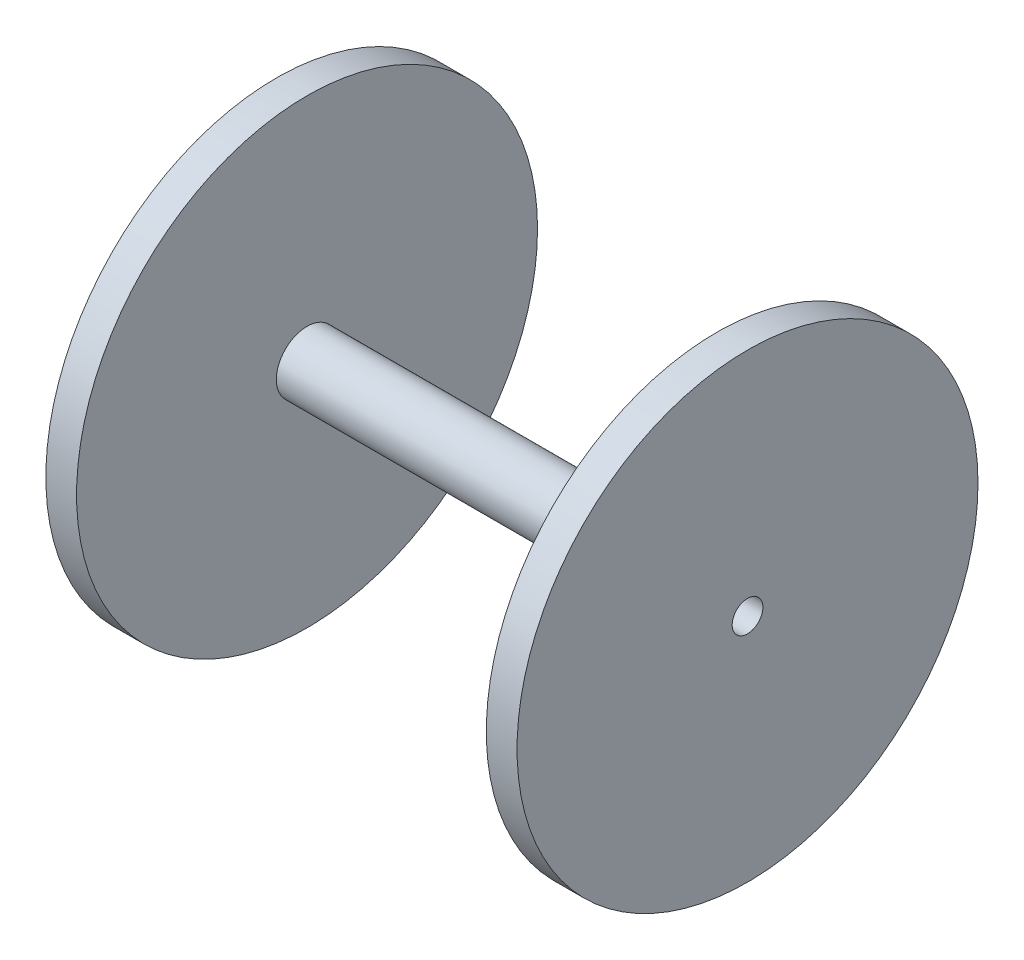
ISO-10303-21;
HEADER;
FILE_DESCRIPTION(('STEP AP214'),'2;1');
FILE_NAME('part.step','',(''),(''),'','','');
FILE_SCHEMA(('AUTOMOTIVE_DESIGN { 1 0 10303 214 1 1 1 1 }'));
ENDSEC;
DATA;
#1=APPLICATION_CONTEXT('core data for automotive mechanical design processes');
#2=APPLICATION_PROTOCOL_DEFINITION('international standard','automotive_design',2000,#1);
#3=PRODUCT_CONTEXT('',#1,'mechanical');
#4=PRODUCT('Part','Part','',(#3));
#5=PRODUCT_RELATED_PRODUCT_CATEGORY('part','',(#4));
#6=PRODUCT_DEFINITION_FORMATION('','',#4);
#7=PRODUCT_DEFINITION_CONTEXT('part definition',#1,'design');
#8=PRODUCT_DEFINITION('design','',#6,#7);
#9=PRODUCT_DEFINITION_SHAPE('','',#8);
#10=(LENGTH_UNIT() NAMED_UNIT(*) SI_UNIT(.MILLI.,.METRE.));
#11=(NAMED_UNIT(*) PLANE_ANGLE_UNIT() SI_UNIT($,.RADIAN.));
#12=(NAMED_UNIT(*) SI_UNIT($,.STERADIAN.) SOLID_ANGLE_UNIT());
#13=UNCERTAINTY_MEASURE_WITH_UNIT(LENGTH_MEASURE(1.E-05),#10,'distance_accuracy_value','');
#14=(GEOMETRIC_REPRESENTATION_CONTEXT(3) GLOBAL_UNCERTAINTY_ASSIGNED_CONTEXT((#13)) GLOBAL_UNIT_ASSIGNED_CONTEXT((#10,
#11,#12)) REPRESENTATION_CONTEXT('',''));
#15=CARTESIAN_POINT('',(0.,0.,0.));
#16=DIRECTION('',(0.,0.,1.));
#17=DIRECTION('',(1.,0.,0.));
#18=AXIS2_PLACEMENT_3D('',#15,#16,#17);
#19=CARTESIAN_POINT('',(40.,0.,0.));
#20=DIRECTION('',(-1.,0.,0.));
#21=DIRECTION('',(0.,0.,1.));
#22=AXIS2_PLACEMENT_3D('',#19,#20,#21);
#23=CYLINDRICAL_SURFACE('',#22,3.);
#24=CARTESIAN_POINT('',(40.,0.,0.));
#25=DIRECTION('',(1.,0.,0.));
#26=DIRECTION('',(0.,0.,-1.));
#27=AXIS2_PLACEMENT_3D('',#24,#25,#26);
#28=CIRCLE('',#27,3.);
#29=CARTESIAN_POINT('',(40.,0.,-3.));
#30=VERTEX_POINT('',#29);
#31=EDGE_CURVE('E11',#30,#30,#28,.T.);
#32=ORIENTED_EDGE('',*,*,#31,.F.);
#33=EDGE_LOOP('',(#32));
#34=FACE_BOUND('',#33,.T.);
#35=CARTESIAN_POINT('',(0.,0.,0.));
#36=DIRECTION('',(1.,0.,0.));
#37=DIRECTION('',(0.,0.,-1.));
#38=AXIS2_PLACEMENT_3D('',#35,#36,#37);
#39=CIRCLE('',#38,3.);
#40=CARTESIAN_POINT('',(0.,0.,-3.));
#41=VERTEX_POINT('',#40);
#42=EDGE_CURVE('E42',#41,#41,#39,.T.);
#43=ORIENTED_EDGE('',*,*,#42,.T.);
#44=EDGE_LOOP('',(#43));
#45=FACE_BOUND('',#44,.T.);
#46=ADVANCED_FACE('F41',(#34,#45),#23,.T.);
#47=CARTESIAN_POINT('',(40.,0.,0.));
#48=DIRECTION('',(-1.,0.,0.));
#49=DIRECTION('',(0.,0.,1.));
#50=AXIS2_PLACEMENT_3D('',#47,#48,#49);
#51=CYLINDRICAL_SURFACE('',#50,1.5);
#52=DIRECTION('',(-1.,0.,0.));
#53=VECTOR('',#52,1.);
#54=CARTESIAN_POINT('',(7.,1.1180339887499,-1.));
#55=LINE('',#54,#53);
#56=CARTESIAN_POINT('',(7.,1.1180339887499,-1.));
#57=VERTEX_POINT('',#56);
#58=CARTESIAN_POINT('',(-3.,1.1180339887499,-1.));
#59=VERTEX_POINT('',#58);
#60=EDGE_CURVE('E71',#57,#59,#55,.T.);
#61=ORIENTED_EDGE('',*,*,#60,.F.);
#62=CARTESIAN_POINT('',(7.,0.,0.));
#63=DIRECTION('',(-1.,0.,0.));
#64=DIRECTION('',(0.,0.,1.));
#65=AXIS2_PLACEMENT_3D('',#62,#63,#64);
#66=CIRCLE('',#65,1.5);
#67=CARTESIAN_POINT('',(7.,-1.1180339887499,-1.));
#68=VERTEX_POINT('',#67);
#69=EDGE_CURVE('E65',#57,#68,#66,.T.);
#70=ORIENTED_EDGE('',*,*,#69,.T.);
#71=DIRECTION('',(-1.,0.,0.));
#72=VECTOR('',#71,1.);
#73=CARTESIAN_POINT('',(7.,-1.1180339887499,-1.));
#74=LINE('',#73,#72);
#75=CARTESIAN_POINT('',(-3.,-1.1180339887499,-1.));
#76=VERTEX_POINT('',#75);
#77=EDGE_CURVE('E72',#68,#76,#74,.T.);
#78=ORIENTED_EDGE('',*,*,#77,.T.);
#79=CARTESIAN_POINT('',(-3.,0.,0.));
#80=DIRECTION('',(1.,0.,0.));
#81=DIRECTION('',(0.,0.,-1.));
#82=AXIS2_PLACEMENT_3D('',#79,#80,#81);
#83=CIRCLE('',#82,1.5);
#84=EDGE_CURVE('E78',#59,#76,#83,.T.);
#85=ORIENTED_EDGE('',*,*,#84,.F.);
#86=EDGE_LOOP('',(#61,#70,#78,#85));
#87=FACE_BOUND('',#86,.T.);
#88=CARTESIAN_POINT('',(43.,0.,0.));
#89=DIRECTION('',(1.,0.,0.));
#90=DIRECTION('',(0.,0.,-1.));
#91=AXIS2_PLACEMENT_3D('',#88,#89,#90);
#92=CIRCLE('',#91,1.5);
#93=CARTESIAN_POINT('',(43.,0.,-1.5));
#94=VERTEX_POINT('',#93);
#95=EDGE_CURVE('E91',#94,#94,#92,.T.);
#96=ORIENTED_EDGE('',*,*,#95,.T.);
#97=EDGE_LOOP('',(#96));
#98=FACE_BOUND('',#97,.T.);
#99=ADVANCED_FACE('F76',(#87,#98),#51,.F.);
#100=CARTESIAN_POINT('',(43.,0.,0.));
#101=DIRECTION('',(1.,0.,0.));
#102=DIRECTION('',(0.,0.,-1.));
#103=AXIS2_PLACEMENT_3D('',#100,#101,#102);
#104=PLANE('',#103);
#105=CARTESIAN_POINT('',(43.,0.,0.));
#106=DIRECTION('',(1.,0.,0.));
#107=DIRECTION('',(0.,0.,-1.));
#108=AXIS2_PLACEMENT_3D('',#105,#106,#107);
#109=CIRCLE('',#108,22.5);
#110=CARTESIAN_POINT('',(43.,0.,-22.5));
#111=VERTEX_POINT('',#110);
#112=EDGE_CURVE('E47',#111,#111,#109,.T.);
#113=ORIENTED_EDGE('',*,*,#112,.T.);
#114=EDGE_LOOP('',(#113));
#115=FACE_BOUND('',#114,.T.);
#116=ORIENTED_EDGE('',*,*,#95,.F.);
#117=EDGE_LOOP('',(#116));
#118=FACE_BOUND('',#117,.T.);
#119=ADVANCED_FACE('F106',(#115,#118),#104,.T.);
#120=CARTESIAN_POINT('',(40.,0.,0.));
#121=DIRECTION('',(1.,0.,0.));
#122=DIRECTION('',(0.,0.,-1.));
#123=AXIS2_PLACEMENT_3D('',#120,#121,#122);
#124=PLANE('',#123);
#125=ORIENTED_EDGE('',*,*,#31,.T.);
#126=EDGE_LOOP('',(#125));
#127=FACE_BOUND('',#126,.T.);
#128=CARTESIAN_POINT('',(40.,0.,0.));
#129=DIRECTION('',(1.,0.,0.));
#130=DIRECTION('',(0.,0.,-1.));
#131=AXIS2_PLACEMENT_3D('',#128,#129,#130);
#132=CIRCLE('',#131,22.5);
#133=CARTESIAN_POINT('',(40.,0.,-22.5));
#134=VERTEX_POINT('',#133);
#135=EDGE_CURVE('E96',#134,#134,#132,.T.);
#136=ORIENTED_EDGE('',*,*,#135,.F.);
#137=EDGE_LOOP('',(#136));
#138=FACE_BOUND('',#137,.T.);
#139=ADVANCED_FACE('F102',(#127,#138),#124,.F.);
#140=CARTESIAN_POINT('',(43.,0.,0.));
#141=DIRECTION('',(-1.,0.,0.));
#142=DIRECTION('',(0.,0.,1.));
#143=AXIS2_PLACEMENT_3D('',#140,#141,#142);
#144=CYLINDRICAL_SURFACE('',#143,22.5);
#145=ORIENTED_EDGE('',*,*,#112,.F.);
#146=EDGE_LOOP('',(#145));
#147=FACE_BOUND('',#146,.T.);
#148=ORIENTED_EDGE('',*,*,#135,.T.);
#149=EDGE_LOOP('',(#148));
#150=FACE_BOUND('',#149,.T.);
#151=ADVANCED_FACE('F105',(#147,#150),#144,.T.);
#152=CARTESIAN_POINT('',(-3.,0.,0.));
#153=DIRECTION('',(1.,0.,0.));
#154=DIRECTION('',(0.,0.,-1.));
#155=AXIS2_PLACEMENT_3D('',#152,#153,#154);
#156=CYLINDRICAL_SURFACE('',#155,22.5);
#157=CARTESIAN_POINT('',(-3.,0.,0.));
#158=DIRECTION('',(1.,0.,0.));
#159=DIRECTION('',(0.,0.,-1.));
#160=AXIS2_PLACEMENT_3D('',#157,#158,#159);
#161=CIRCLE('',#160,22.5);
#162=CARTESIAN_POINT('',(-3.,0.,-22.5));
#163=VERTEX_POINT('',#162);
#164=EDGE_CURVE('E87',#163,#163,#161,.T.);
#165=ORIENTED_EDGE('',*,*,#164,.T.);
#166=EDGE_LOOP('',(#165));
#167=FACE_BOUND('',#166,.T.);
#168=CARTESIAN_POINT('',(0.,0.,0.));
#169=DIRECTION('',(1.,0.,0.));
#170=DIRECTION('',(0.,0.,-1.));
#171=AXIS2_PLACEMENT_3D('',#168,#169,#170);
#172=CIRCLE('',#171,22.5);
#173=CARTESIAN_POINT('',(0.,0.,-22.5));
#174=VERTEX_POINT('',#173);
#175=EDGE_CURVE('E82',#174,#174,#172,.T.);
#176=ORIENTED_EDGE('',*,*,#175,.F.);
#177=EDGE_LOOP('',(#176));
#178=FACE_BOUND('',#177,.T.);
#179=ADVANCED_FACE('F114',(#167,#178),#156,.T.);
#180=CARTESIAN_POINT('',(-3.,0.,0.));
#181=DIRECTION('',(-1.,0.,0.));
#182=DIRECTION('',(0.,0.,-1.));
#183=AXIS2_PLACEMENT_3D('',#180,#181,#182);
#184=PLANE('',#183);
#185=ORIENTED_EDGE('',*,*,#84,.T.);
#186=DIRECTION('',(0.,1.,0.));
#187=VECTOR('',#186,1.);
#188=CARTESIAN_POINT('',(-3.,1.1180339887499,-1.));
#189=LINE('',#188,#187);
#190=EDGE_CURVE('E54',#76,#59,#189,.T.);
#191=ORIENTED_EDGE('',*,*,#190,.T.);
#192=EDGE_LOOP('',(#185,#191));
#193=FACE_BOUND('',#192,.T.);
#194=ORIENTED_EDGE('',*,*,#164,.F.);
#195=EDGE_LOOP('',(#194));
#196=FACE_BOUND('',#195,.T.);
#197=ADVANCED_FACE('F85',(#193,#196),#184,.T.);
#198=CARTESIAN_POINT('',(0.,0.,0.));
#199=DIRECTION('',(-1.,0.,0.));
#200=DIRECTION('',(0.,0.,-1.));
#201=AXIS2_PLACEMENT_3D('',#198,#199,#200);
#202=PLANE('',#201);
#203=ORIENTED_EDGE('',*,*,#42,.F.);
#204=EDGE_LOOP('',(#203));
#205=FACE_BOUND('',#204,.T.);
#206=ORIENTED_EDGE('',*,*,#175,.T.);
#207=EDGE_LOOP('',(#206));
#208=FACE_BOUND('',#207,.T.);
#209=ADVANCED_FACE('F126',(#205,#208),#202,.F.);
#210=CARTESIAN_POINT('',(7.,1.1180339887499,-1.));
#211=DIRECTION('',(0.,0.,1.));
#212=DIRECTION('',(1.,0.,0.));
#213=AXIS2_PLACEMENT_3D('',#210,#211,#212);
#214=PLANE('',#213);
#215=ORIENTED_EDGE('',*,*,#190,.F.);
#216=ORIENTED_EDGE('',*,*,#77,.F.);
#217=DIRECTION('',(0.,1.,0.));
#218=VECTOR('',#217,1.);
#219=CARTESIAN_POINT('',(7.,1.1180339887499,-1.));
#220=LINE('',#219,#218);
#221=EDGE_CURVE('E77',#68,#57,#220,.T.);
#222=ORIENTED_EDGE('',*,*,#221,.T.);
#223=ORIENTED_EDGE('',*,*,#60,.T.);
#224=EDGE_LOOP('',(#215,#216,#222,#223));
#225=FACE_BOUND('',#224,.T.);
#226=ADVANCED_FACE('F69',(#225),#214,.T.);
#227=CARTESIAN_POINT('',(7.,0.,0.));
#228=DIRECTION('',(-1.,0.,0.));
#229=DIRECTION('',(0.,0.,1.));
#230=AXIS2_PLACEMENT_3D('',#227,#228,#229);
#231=PLANE('',#230);
#232=ORIENTED_EDGE('',*,*,#69,.F.);
#233=ORIENTED_EDGE('',*,*,#221,.F.);
#234=EDGE_LOOP('',(#232,#233));
#235=FACE_BOUND('',#234,.T.);
#236=ADVANCED_FACE('F145',(#235),#231,.F.);
#237=CLOSED_SHELL('',(#46,#99,#119,#139,#151,#179,#197,#209,#226,#236));
#238=MANIFOLD_SOLID_BREP('B2',#237);
#239=ADVANCED_BREP_SHAPE_REPRESENTATION('',(#18,#238),#14);
#240=SHAPE_DEFINITION_REPRESENTATION(#9,#239);
ENDSEC;
END-ISO-10303-21;
